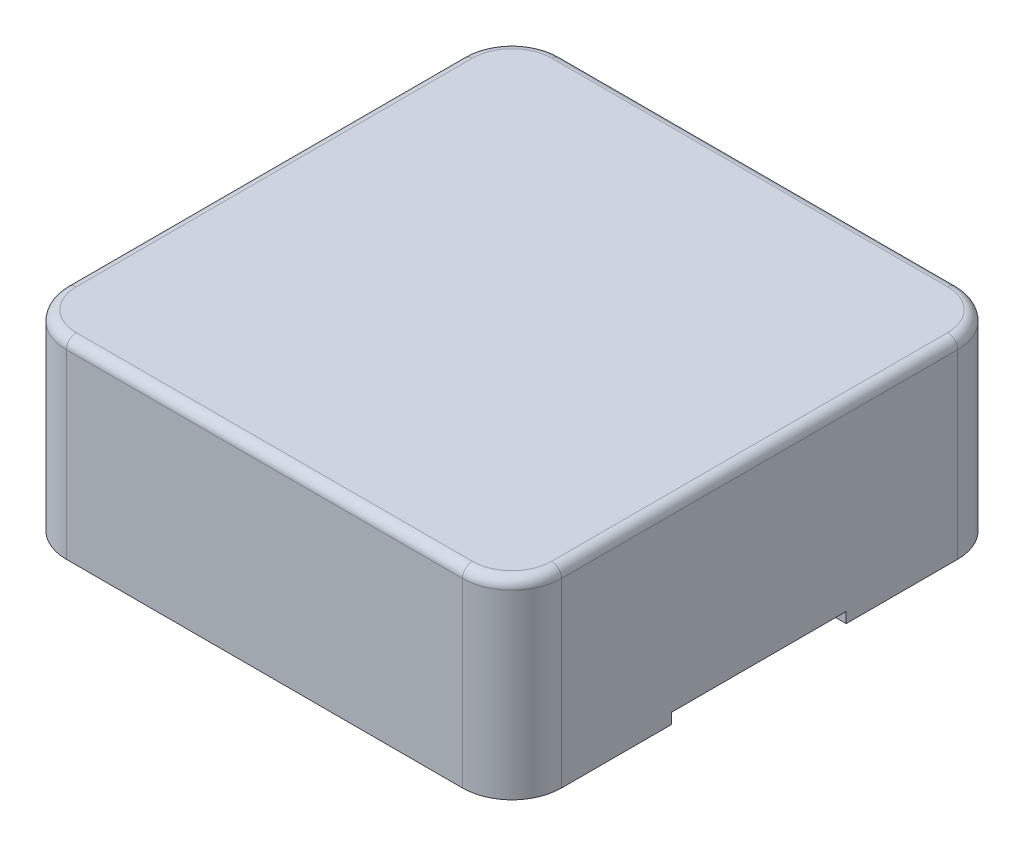
ISO-10303-21;
HEADER;
FILE_DESCRIPTION(('STEP AP214'),'2;1');
FILE_NAME('part.step','',(''),(''),'','','');
FILE_SCHEMA(('AUTOMOTIVE_DESIGN { 1 0 10303 214 1 1 1 1 }'));
ENDSEC;
DATA;
#1=APPLICATION_CONTEXT('core data for automotive mechanical design processes');
#2=APPLICATION_PROTOCOL_DEFINITION('international standard','automotive_design',2000,#1);
#3=PRODUCT_CONTEXT('',#1,'mechanical');
#4=PRODUCT('Part','Part','',(#3));
#5=PRODUCT_RELATED_PRODUCT_CATEGORY('part','',(#4));
#6=PRODUCT_DEFINITION_FORMATION('','',#4);
#7=PRODUCT_DEFINITION_CONTEXT('part definition',#1,'design');
#8=PRODUCT_DEFINITION('design','',#6,#7);
#9=PRODUCT_DEFINITION_SHAPE('','',#8);
#10=(LENGTH_UNIT() NAMED_UNIT(*) SI_UNIT(.MILLI.,.METRE.));
#11=(NAMED_UNIT(*) PLANE_ANGLE_UNIT() SI_UNIT($,.RADIAN.));
#12=(NAMED_UNIT(*) SI_UNIT($,.STERADIAN.) SOLID_ANGLE_UNIT());
#13=UNCERTAINTY_MEASURE_WITH_UNIT(LENGTH_MEASURE(1.E-05),#10,'distance_accuracy_value','');
#14=(GEOMETRIC_REPRESENTATION_CONTEXT(3) GLOBAL_UNCERTAINTY_ASSIGNED_CONTEXT((#13)) GLOBAL_UNIT_ASSIGNED_CONTEXT((#10,
#11,#12)) REPRESENTATION_CONTEXT('',''));
#15=CARTESIAN_POINT('',(0.,0.,0.));
#16=DIRECTION('',(0.,0.,1.));
#17=DIRECTION('',(1.,0.,0.));
#18=AXIS2_PLACEMENT_3D('',#15,#16,#17);
#19=CARTESIAN_POINT('',(2.108463048935,-1.899999976158,1.764024019241));
#20=DIRECTION('',(0.,0.,1.));
#21=DIRECTION('',(0.,-1.,0.));
#22=AXIS2_PLACEMENT_3D('',#19,#20,#21);
#23=PLANE('',#22);
#24=DIRECTION('',(0.,1.,0.));
#25=VECTOR('',#24,1.);
#26=CARTESIAN_POINT('',(2.108463048935,-1.899999976158,1.764024019241));
#27=LINE('',#26,#25);
#28=CARTESIAN_POINT('',(2.108463048935,-1.90000007152543,1.764024019241));
#29=VERTEX_POINT('',#28);
#30=CARTESIAN_POINT('',(2.108463048935,-1.685999976158,1.764024019241));
#31=VERTEX_POINT('',#30);
#32=EDGE_CURVE('E200',#29,#31,#27,.T.);
#33=ORIENTED_EDGE('',*,*,#32,.T.);
#34=DIRECTION('',(1.,0.,0.));
#35=VECTOR('',#34,1.);
#36=CARTESIAN_POINT('',(0.035624027251997,-1.685999976158,1.764024019241));
#37=LINE('',#36,#35);
#38=CARTESIAN_POINT('',(5.035624027252,-1.685999976158,1.764024019241));
#39=VERTEX_POINT('',#38);
#40=EDGE_CURVE('E248',#31,#39,#37,.T.);
#41=ORIENTED_EDGE('',*,*,#40,.T.);
#42=DIRECTION('',(0.,-1.,0.));
#43=VECTOR('',#42,1.);
#44=CARTESIAN_POINT('',(5.035624027252,-1.899999976158,1.764024019241));
#45=LINE('',#44,#43);
#46=CARTESIAN_POINT('',(5.03562402725199,-1.90000000794714,1.764024019241));
#47=VERTEX_POINT('',#46);
#48=EDGE_CURVE('E236',#47,#39,#45,.F.);
#49=ORIENTED_EDGE('',*,*,#48,.F.);
#50=DIRECTION('',(1.,0.,0.));
#51=VECTOR('',#50,1.);
#52=CARTESIAN_POINT('',(0.035624027251997,-1.90000007152543,1.764024019241));
#53=LINE('',#52,#51);
#54=EDGE_CURVE('E174',#29,#47,#53,.T.);
#55=ORIENTED_EDGE('',*,*,#54,.F.);
#56=EDGE_LOOP('',(#33,#41,#49,#55));
#57=FACE_BOUND('',#56,.T.);
#58=ADVANCED_FACE('F17',(#57),#23,.F.);
#59=CARTESIAN_POINT('',(-4.964375972748,-1.899999976158,1.764024019241));
#60=DIRECTION('',(0.,0.,1.));
#61=DIRECTION('',(0.,-1.,0.));
#62=AXIS2_PLACEMENT_3D('',#59,#60,#61);
#63=PLANE('',#62);
#64=DIRECTION('',(0.,-1.,0.));
#65=VECTOR('',#64,1.);
#66=CARTESIAN_POINT('',(-4.964375972748,-1.899999976158,1.764024019241));
#67=LINE('',#66,#65);
#68=CARTESIAN_POINT('',(-4.964375972748,-1.685999976158,1.764024019241));
#69=VERTEX_POINT('',#68);
#70=CARTESIAN_POINT('',(-4.964375972748,-1.90000000794714,1.764024019241));
#71=VERTEX_POINT('',#70);
#72=EDGE_CURVE('E232',#69,#71,#67,.T.);
#73=ORIENTED_EDGE('',*,*,#72,.F.);
#74=DIRECTION('',(1.,0.,0.));
#75=VECTOR('',#74,1.);
#76=CARTESIAN_POINT('',(0.035624027251997,-1.685999976158,1.764024019241));
#77=LINE('',#76,#75);
#78=CARTESIAN_POINT('',(-2.071772098541,-1.685999976158,1.764024019241));
#79=VERTEX_POINT('',#78);
#80=EDGE_CURVE('E269',#69,#79,#77,.T.);
#81=ORIENTED_EDGE('',*,*,#80,.T.);
#82=DIRECTION('',(0.,1.,0.));
#83=VECTOR('',#82,1.);
#84=CARTESIAN_POINT('',(-2.071772098541,-1.899999976158,1.764024019241));
#85=LINE('',#84,#83);
#86=CARTESIAN_POINT('',(-2.071772098541,-1.90000007152543,1.764024019241));
#87=VERTEX_POINT('',#86);
#88=EDGE_CURVE('E218',#79,#87,#85,.F.);
#89=ORIENTED_EDGE('',*,*,#88,.T.);
#90=DIRECTION('',(1.,0.,0.));
#91=VECTOR('',#90,1.);
#92=CARTESIAN_POINT('',(0.035624027251997,-1.90000007152543,1.764024019241));
#93=LINE('',#92,#91);
#94=EDGE_CURVE('E173',#71,#87,#93,.T.);
#95=ORIENTED_EDGE('',*,*,#94,.F.);
#96=EDGE_LOOP('',(#73,#81,#89,#95));
#97=FACE_BOUND('',#96,.T.);
#98=ADVANCED_FACE('F625',(#97),#63,.F.);
#99=CARTESIAN_POINT('',(-2.071772098541,-1.899999976158,1.764024019241));
#100=DIRECTION('',(1.,0.,0.));
#101=DIRECTION('',(0.,0.,-1.));
#102=AXIS2_PLACEMENT_3D('',#99,#100,#101);
#103=PLANE('',#102);
#104=ORIENTED_EDGE('',*,*,#88,.F.);
#105=DIRECTION('',(0.,0.,1.));
#106=VECTOR('',#105,1.);
#107=CARTESIAN_POINT('',(-2.071772098541,-1.685999976158,-0.0145459175110019));
#108=LINE('',#107,#106);
#109=CARTESIAN_POINT('',(-2.071772098541,-1.685999976158,-1.764024019241));
#110=VERTEX_POINT('',#109);
#111=EDGE_CURVE('E264',#79,#110,#108,.F.);
#112=ORIENTED_EDGE('',*,*,#111,.T.);
#113=DIRECTION('',(0.,1.,0.));
#114=VECTOR('',#113,1.);
#115=CARTESIAN_POINT('',(-2.071772098541,-1.899999976158,-1.764024019241));
#116=LINE('',#115,#114);
#117=CARTESIAN_POINT('',(-2.071772098541,-1.90000007152543,-1.764024019241));
#118=VERTEX_POINT('',#117);
#119=EDGE_CURVE('E201',#110,#118,#116,.F.);
#120=ORIENTED_EDGE('',*,*,#119,.T.);
#121=DIRECTION('',(0.,0.,-1.));
#122=VECTOR('',#121,1.);
#123=CARTESIAN_POINT('',(-2.071772098541,-1.90000007152543,-0.0145459175110019));
#124=LINE('',#123,#122);
#125=EDGE_CURVE('E225',#87,#118,#124,.T.);
#126=ORIENTED_EDGE('',*,*,#125,.F.);
#127=EDGE_LOOP('',(#104,#112,#120,#126));
#128=FACE_BOUND('',#127,.T.);
#129=ADVANCED_FACE('F622',(#128),#103,.F.);
#130=CARTESIAN_POINT('',(-2.071772098541,-1.899999976158,-1.764024019241));
#131=DIRECTION('',(0.,0.,-1.));
#132=DIRECTION('',(0.,1.,0.));
#133=AXIS2_PLACEMENT_3D('',#130,#131,#132);
#134=PLANE('',#133);
#135=ORIENTED_EDGE('',*,*,#119,.F.);
#136=DIRECTION('',(1.,0.,0.));
#137=VECTOR('',#136,1.);
#138=CARTESIAN_POINT('',(0.035624027251997,-1.685999976158,-1.764024019241));
#139=LINE('',#138,#137);
#140=CARTESIAN_POINT('',(-4.964375972748,-1.685999976158,-1.764024019241));
#141=VERTEX_POINT('',#140);
#142=EDGE_CURVE('E191',#110,#141,#139,.F.);
#143=ORIENTED_EDGE('',*,*,#142,.T.);
#144=DIRECTION('',(0.,1.,0.));
#145=VECTOR('',#144,1.);
#146=CARTESIAN_POINT('',(-4.964375972748,-1.899999976158,-1.764024019241));
#147=LINE('',#146,#145);
#148=CARTESIAN_POINT('',(-4.964375972748,-1.90000000794714,-1.764024019241));
#149=VERTEX_POINT('',#148);
#150=EDGE_CURVE('E216',#149,#141,#147,.T.);
#151=ORIENTED_EDGE('',*,*,#150,.F.);
#152=DIRECTION('',(1.,0.,0.));
#153=VECTOR('',#152,1.);
#154=CARTESIAN_POINT('',(0.035624027251997,-1.90000007152543,-1.764024019241));
#155=LINE('',#154,#153);
#156=EDGE_CURVE('E227',#118,#149,#155,.F.);
#157=ORIENTED_EDGE('',*,*,#156,.F.);
#158=EDGE_LOOP('',(#135,#143,#151,#157));
#159=FACE_BOUND('',#158,.T.);
#160=ADVANCED_FACE('F619',(#159),#134,.F.);
#161=CARTESIAN_POINT('',(5.035624027252,-1.899999976158,-1.764024019241));
#162=DIRECTION('',(0.,0.,-1.));
#163=DIRECTION('',(0.,1.,0.));
#164=AXIS2_PLACEMENT_3D('',#161,#162,#163);
#165=PLANE('',#164);
#166=DIRECTION('',(0.,1.,0.));
#167=VECTOR('',#166,1.);
#168=CARTESIAN_POINT('',(5.035624027252,-1.899999976158,-1.764024019241));
#169=LINE('',#168,#167);
#170=CARTESIAN_POINT('',(5.035624027252,-1.685999976158,-1.764024019241));
#171=VERTEX_POINT('',#170);
#172=CARTESIAN_POINT('',(5.03562402725199,-1.90000000794714,-1.764024019241));
#173=VERTEX_POINT('',#172);
#174=EDGE_CURVE('E198',#171,#173,#169,.F.);
#175=ORIENTED_EDGE('',*,*,#174,.F.);
#176=DIRECTION('',(1.,0.,0.));
#177=VECTOR('',#176,1.);
#178=CARTESIAN_POINT('',(0.035624027251997,-1.685999976158,-1.764024019241));
#179=LINE('',#178,#177);
#180=CARTESIAN_POINT('',(2.108463048935,-1.685999976158,-1.764024019241));
#181=VERTEX_POINT('',#180);
#182=EDGE_CURVE('E207',#171,#181,#179,.F.);
#183=ORIENTED_EDGE('',*,*,#182,.T.);
#184=DIRECTION('',(0.,1.,0.));
#185=VECTOR('',#184,1.);
#186=CARTESIAN_POINT('',(2.108463048935,-1.899999976158,-1.764024019241));
#187=LINE('',#186,#185);
#188=CARTESIAN_POINT('',(2.108463048935,-1.90000007152543,-1.764024019241));
#189=VERTEX_POINT('',#188);
#190=EDGE_CURVE('E204',#181,#189,#187,.F.);
#191=ORIENTED_EDGE('',*,*,#190,.T.);
#192=DIRECTION('',(1.,0.,0.));
#193=VECTOR('',#192,1.);
#194=CARTESIAN_POINT('',(0.035624027251997,-1.90000007152543,-1.764024019241));
#195=LINE('',#194,#193);
#196=EDGE_CURVE('E213',#173,#189,#195,.F.);
#197=ORIENTED_EDGE('',*,*,#196,.F.);
#198=EDGE_LOOP('',(#175,#183,#191,#197));
#199=FACE_BOUND('',#198,.T.);
#200=ADVANCED_FACE('F321',(#199),#165,.F.);
#201=CARTESIAN_POINT('',(2.108463048935,-1.899999976158,-1.764024019241));
#202=DIRECTION('',(-1.,0.,0.));
#203=DIRECTION('',(0.,0.,1.));
#204=AXIS2_PLACEMENT_3D('',#201,#202,#203);
#205=PLANE('',#204);
#206=ORIENTED_EDGE('',*,*,#190,.F.);
#207=DIRECTION('',(0.,0.,1.));
#208=VECTOR('',#207,1.);
#209=CARTESIAN_POINT('',(2.108463048935,-1.685999976158,-0.0145459175110019));
#210=LINE('',#209,#208);
#211=EDGE_CURVE('E245',#181,#31,#210,.T.);
#212=ORIENTED_EDGE('',*,*,#211,.T.);
#213=ORIENTED_EDGE('',*,*,#32,.F.);
#214=DIRECTION('',(0.,0.,-1.));
#215=VECTOR('',#214,1.);
#216=CARTESIAN_POINT('',(2.108463048935,-1.90000007152543,-0.0145459175110019));
#217=LINE('',#216,#215);
#218=EDGE_CURVE('E210',#189,#29,#217,.F.);
#219=ORIENTED_EDGE('',*,*,#218,.F.);
#220=EDGE_LOOP('',(#206,#212,#213,#219));
#221=FACE_BOUND('',#220,.T.);
#222=ADVANCED_FACE('F325',(#221),#205,.F.);
#223=CARTESIAN_POINT('',(0.035624027251997,-1.685999976158,-0.0145459175110019));
#224=DIRECTION('',(0.,1.,0.));
#225=DIRECTION('',(0.,0.,1.));
#226=AXIS2_PLACEMENT_3D('',#223,#224,#225);
#227=PLANE('',#226);
#228=ORIENTED_EDGE('',*,*,#211,.F.);
#229=ORIENTED_EDGE('',*,*,#182,.F.);
#230=DIRECTION('',(0.,0.,-1.));
#231=VECTOR('',#230,1.);
#232=CARTESIAN_POINT('',(5.03562402725199,-1.685999976158,3.985454082489));
#233=LINE('',#232,#231);
#234=EDGE_CURVE('E179',#39,#171,#233,.T.);
#235=ORIENTED_EDGE('',*,*,#234,.F.);
#236=ORIENTED_EDGE('',*,*,#40,.F.);
#237=EDGE_LOOP('',(#228,#229,#235,#236));
#238=FACE_BOUND('',#237,.T.);
#239=ADVANCED_FACE('F330',(#238),#227,.F.);
#240=CARTESIAN_POINT('',(4.035624027252,-1.899999976158,-4.014545917511));
#241=DIRECTION('',(0.,1.,0.));
#242=DIRECTION('',(0.,0.,1.));
#243=AXIS2_PLACEMENT_3D('',#240,#241,#242);
#244=CYLINDRICAL_SURFACE('',#243,1.);
#245=CARTESIAN_POINT('',(4.035624027252,-1.899999976158,-4.014545917511));
#246=DIRECTION('',(0.,1.,0.));
#247=DIRECTION('',(0.,0.,1.));
#248=AXIS2_PLACEMENT_3D('',#245,#246,#247);
#249=CIRCLE('',#248,1.);
#250=CARTESIAN_POINT('',(4.035624027252,-1.899999976158,-5.014545917511));
#251=VERTEX_POINT('',#250);
#252=CARTESIAN_POINT('',(5.03562402725199,-1.899999976158,-4.014545917511));
#253=VERTEX_POINT('',#252);
#254=EDGE_CURVE('E286',#251,#253,#249,.F.);
#255=ORIENTED_EDGE('',*,*,#254,.F.);
#256=DIRECTION('',(0.,1.,0.));
#257=VECTOR('',#256,1.);
#258=CARTESIAN_POINT('',(4.035624027252,-1.899999976158,-5.014545917511));
#259=LINE('',#258,#257);
#260=CARTESIAN_POINT('',(4.035624027252,1.766130018234,-5.014545917511));
#261=VERTEX_POINT('',#260);
#262=EDGE_CURVE('E197',#261,#251,#259,.F.);
#263=ORIENTED_EDGE('',*,*,#262,.F.);
#264=CARTESIAN_POINT('',(4.035624027252,1.766130018234,-4.014545917511));
#265=DIRECTION('',(0.,1.,0.));
#266=DIRECTION('',(0.,0.,1.));
#267=AXIS2_PLACEMENT_3D('',#264,#265,#266);
#268=CIRCLE('',#267,1.);
#269=CARTESIAN_POINT('',(5.03562402725199,1.766130018234,-4.014545917511));
#270=VERTEX_POINT('',#269);
#271=EDGE_CURVE('E257',#261,#270,#268,.F.);
#272=ORIENTED_EDGE('',*,*,#271,.T.);
#273=DIRECTION('',(0.,1.,0.));
#274=VECTOR('',#273,1.);
#275=CARTESIAN_POINT('',(5.03562402725199,-1.899999976158,-4.014545917511));
#276=LINE('',#275,#274);
#277=EDGE_CURVE('E315',#253,#270,#276,.T.);
#278=ORIENTED_EDGE('',*,*,#277,.F.);
#279=EDGE_LOOP('',(#255,#263,#272,#278));
#280=FACE_BOUND('',#279,.T.);
#281=ADVANCED_FACE('F334',(#280),#244,.T.);
#282=CARTESIAN_POINT('',(4.035624027252,-1.899999976158,3.985454082489));
#283=DIRECTION('',(0.,1.,0.));
#284=DIRECTION('',(0.,0.,1.));
#285=AXIS2_PLACEMENT_3D('',#282,#283,#284);
#286=CYLINDRICAL_SURFACE('',#285,0.999999999999998);
#287=CARTESIAN_POINT('',(4.035624027252,-1.899999976158,3.985454082489));
#288=DIRECTION('',(0.,1.,0.));
#289=DIRECTION('',(0.,0.,1.));
#290=AXIS2_PLACEMENT_3D('',#287,#288,#289);
#291=CIRCLE('',#290,0.999999999999998);
#292=CARTESIAN_POINT('',(5.03562402725199,-1.899999976158,3.985454082489));
#293=VERTEX_POINT('',#292);
#294=CARTESIAN_POINT('',(4.035624027252,-1.899999976158,4.985454082489));
#295=VERTEX_POINT('',#294);
#296=EDGE_CURVE('E20',#293,#295,#291,.F.);
#297=ORIENTED_EDGE('',*,*,#296,.F.);
#298=DIRECTION('',(0.,1.,0.));
#299=VECTOR('',#298,1.);
#300=CARTESIAN_POINT('',(5.03562402725199,-1.899999976158,3.985454082489));
#301=LINE('',#300,#299);
#302=CARTESIAN_POINT('',(5.03562402725199,1.766130018234,3.985454082489));
#303=VERTEX_POINT('',#302);
#304=EDGE_CURVE('E152',#303,#293,#301,.F.);
#305=ORIENTED_EDGE('',*,*,#304,.F.);
#306=CARTESIAN_POINT('',(4.035624027252,1.766130018234,3.985454082489));
#307=DIRECTION('',(0.,1.,0.));
#308=DIRECTION('',(0.,0.,1.));
#309=AXIS2_PLACEMENT_3D('',#306,#307,#308);
#310=CIRCLE('',#309,0.999999999999998);
#311=CARTESIAN_POINT('',(4.035624027252,1.766130018234,4.985454082489));
#312=VERTEX_POINT('',#311);
#313=EDGE_CURVE('E302',#303,#312,#310,.F.);
#314=ORIENTED_EDGE('',*,*,#313,.T.);
#315=DIRECTION('',(0.,-1.,0.));
#316=VECTOR('',#315,1.);
#317=CARTESIAN_POINT('',(4.035624027252,-1.899999976158,4.985454082489));
#318=LINE('',#317,#316);
#319=EDGE_CURVE('E169',#295,#312,#318,.F.);
#320=ORIENTED_EDGE('',*,*,#319,.F.);
#321=EDGE_LOOP('',(#297,#305,#314,#320));
#322=FACE_BOUND('',#321,.T.);
#323=ADVANCED_FACE('F167',(#322),#286,.T.);
#324=CARTESIAN_POINT('',(-3.964375972748,-1.899999976158,-4.014545917511));
#325=DIRECTION('',(0.,1.,0.));
#326=DIRECTION('',(0.,0.,1.));
#327=AXIS2_PLACEMENT_3D('',#324,#325,#326);
#328=CYLINDRICAL_SURFACE('',#327,1.);
#329=CARTESIAN_POINT('',(-3.964375972748,-1.899999976158,-4.014545917511));
#330=DIRECTION('',(0.,1.,0.));
#331=DIRECTION('',(0.,0.,1.));
#332=AXIS2_PLACEMENT_3D('',#329,#330,#331);
#333=CIRCLE('',#332,1.);
#334=CARTESIAN_POINT('',(-4.964375972748,-1.899999976158,-4.014545917511));
#335=VERTEX_POINT('',#334);
#336=CARTESIAN_POINT('',(-3.964375972748,-1.899999976158,-5.014545917511));
#337=VERTEX_POINT('',#336);
#338=EDGE_CURVE('E287',#335,#337,#333,.F.);
#339=ORIENTED_EDGE('',*,*,#338,.F.);
#340=DIRECTION('',(0.,1.,0.));
#341=VECTOR('',#340,1.);
#342=CARTESIAN_POINT('',(-4.964375972748,-1.899999976158,-4.014545917511));
#343=LINE('',#342,#341);
#344=CARTESIAN_POINT('',(-4.964375972748,1.766130018234,-4.014545917511));
#345=VERTEX_POINT('',#344);
#346=EDGE_CURVE('E367',#345,#335,#343,.F.);
#347=ORIENTED_EDGE('',*,*,#346,.F.);
#348=CARTESIAN_POINT('',(-3.964375972748,1.766130018234,-4.014545917511));
#349=DIRECTION('',(0.,1.,0.));
#350=DIRECTION('',(0.,0.,1.));
#351=AXIS2_PLACEMENT_3D('',#348,#349,#350);
#352=CIRCLE('',#351,1.);
#353=CARTESIAN_POINT('',(-3.964375972748,1.766130018234,-5.014545917511));
#354=VERTEX_POINT('',#353);
#355=EDGE_CURVE('E281',#345,#354,#352,.F.);
#356=ORIENTED_EDGE('',*,*,#355,.T.);
#357=DIRECTION('',(0.,1.,0.));
#358=VECTOR('',#357,1.);
#359=CARTESIAN_POINT('',(-3.964375972748,-1.899999976158,-5.014545917511));
#360=LINE('',#359,#358);
#361=EDGE_CURVE('E163',#337,#354,#360,.T.);
#362=ORIENTED_EDGE('',*,*,#361,.F.);
#363=EDGE_LOOP('',(#339,#347,#356,#362));
#364=FACE_BOUND('',#363,.T.);
#365=ADVANCED_FACE('F604',(#364),#328,.T.);
#366=CARTESIAN_POINT('',(0.035624027251997,-1.685999976158,-0.0145459175110019));
#367=DIRECTION('',(0.,1.,0.));
#368=DIRECTION('',(0.,0.,1.));
#369=AXIS2_PLACEMENT_3D('',#366,#367,#368);
#370=PLANE('',#369);
#371=ORIENTED_EDGE('',*,*,#111,.F.);
#372=ORIENTED_EDGE('',*,*,#80,.F.);
#373=DIRECTION('',(0.,0.,1.));
#374=VECTOR('',#373,1.);
#375=CARTESIAN_POINT('',(-4.964375972748,-1.685999976158,-4.014545917511));
#376=LINE('',#375,#374);
#377=EDGE_CURVE('E272',#141,#69,#376,.T.);
#378=ORIENTED_EDGE('',*,*,#377,.F.);
#379=ORIENTED_EDGE('',*,*,#142,.F.);
#380=EDGE_LOOP('',(#371,#372,#378,#379));
#381=FACE_BOUND('',#380,.T.);
#382=ADVANCED_FACE('F598',(#381),#370,.F.);
#383=CARTESIAN_POINT('',(0.035624027251997,-1.90000007152543,-0.0145459175110019));
#384=DIRECTION('',(0.,-1.,0.));
#385=DIRECTION('',(0.,0.,-1.));
#386=AXIS2_PLACEMENT_3D('',#383,#384,#385);
#387=PLANE('',#386);
#388=ORIENTED_EDGE('',*,*,#196,.T.);
#389=ORIENTED_EDGE('',*,*,#218,.T.);
#390=ORIENTED_EDGE('',*,*,#54,.T.);
#391=DIRECTION('',(0.,0.,-1.));
#392=VECTOR('',#391,1.);
#393=CARTESIAN_POINT('',(5.03562402725199,-1.899999976158,3.985454082489));
#394=LINE('',#393,#392);
#395=EDGE_CURVE('E157',#293,#47,#394,.T.);
#396=ORIENTED_EDGE('',*,*,#395,.F.);
#397=ORIENTED_EDGE('',*,*,#296,.T.);
#398=DIRECTION('',(1.,0.,0.));
#399=VECTOR('',#398,1.);
#400=CARTESIAN_POINT('',(-3.964375972748,-1.899999976158,4.985454082489));
#401=LINE('',#400,#399);
#402=CARTESIAN_POINT('',(-3.964375972748,-1.899999976158,4.985454082489));
#403=VERTEX_POINT('',#402);
#404=EDGE_CURVE('E308',#403,#295,#401,.T.);
#405=ORIENTED_EDGE('',*,*,#404,.F.);
#406=CARTESIAN_POINT('',(-3.964375972748,-1.899999976158,3.985454082489));
#407=DIRECTION('',(0.,1.,0.));
#408=DIRECTION('',(0.,0.,1.));
#409=AXIS2_PLACEMENT_3D('',#406,#407,#408);
#410=CIRCLE('',#409,0.999999999999999);
#411=CARTESIAN_POINT('',(-4.964375972748,-1.899999976158,3.985454082489));
#412=VERTEX_POINT('',#411);
#413=EDGE_CURVE('E284',#412,#403,#410,.T.);
#414=ORIENTED_EDGE('',*,*,#413,.F.);
#415=DIRECTION('',(0.,0.,1.));
#416=VECTOR('',#415,1.);
#417=CARTESIAN_POINT('',(-4.964375972748,-1.899999976158,-4.014545917511));
#418=LINE('',#417,#416);
#419=EDGE_CURVE('E275',#71,#412,#418,.T.);
#420=ORIENTED_EDGE('',*,*,#419,.F.);
#421=ORIENTED_EDGE('',*,*,#94,.T.);
#422=ORIENTED_EDGE('',*,*,#125,.T.);
#423=ORIENTED_EDGE('',*,*,#156,.T.);
#424=DIRECTION('',(0.,0.,1.));
#425=VECTOR('',#424,1.);
#426=CARTESIAN_POINT('',(-4.964375972748,-1.899999976158,-4.014545917511));
#427=LINE('',#426,#425);
#428=EDGE_CURVE('E276',#335,#149,#427,.T.);
#429=ORIENTED_EDGE('',*,*,#428,.F.);
#430=ORIENTED_EDGE('',*,*,#338,.T.);
#431=DIRECTION('',(1.,0.,0.));
#432=VECTOR('',#431,1.);
#433=CARTESIAN_POINT('',(4.035624027252,-1.899999976158,-5.014545917511));
#434=LINE('',#433,#432);
#435=EDGE_CURVE('E194',#251,#337,#434,.F.);
#436=ORIENTED_EDGE('',*,*,#435,.F.);
#437=ORIENTED_EDGE('',*,*,#254,.T.);
#438=DIRECTION('',(0.,0.,-1.));
#439=VECTOR('',#438,1.);
#440=CARTESIAN_POINT('',(5.03562402725199,-1.899999976158,3.985454082489));
#441=LINE('',#440,#439);
#442=EDGE_CURVE('E182',#173,#253,#441,.T.);
#443=ORIENTED_EDGE('',*,*,#442,.F.);
#444=EDGE_LOOP('',(#388,#389,#390,#396,#397,#405,#414,#420,#421,#422,#423,#429,#430,#436,#437,#443));
#445=FACE_BOUND('',#444,.T.);
#446=ADVANCED_FACE('F176',(#445),#387,.T.);
#447=CARTESIAN_POINT('',(-3.964375972748,-1.899999976158,3.985454082489));
#448=DIRECTION('',(0.,1.,0.));
#449=DIRECTION('',(0.,0.,1.));
#450=AXIS2_PLACEMENT_3D('',#447,#448,#449);
#451=CYLINDRICAL_SURFACE('',#450,0.999999999999999);
#452=ORIENTED_EDGE('',*,*,#413,.T.);
#453=DIRECTION('',(0.,-1.,0.));
#454=VECTOR('',#453,1.);
#455=CARTESIAN_POINT('',(-3.964375972748,-1.899999976158,4.985454082489));
#456=LINE('',#455,#454);
#457=CARTESIAN_POINT('',(-3.964375972748,1.766130018234,4.985454082489));
#458=VERTEX_POINT('',#457);
#459=EDGE_CURVE('E310',#458,#403,#456,.T.);
#460=ORIENTED_EDGE('',*,*,#459,.F.);
#461=CARTESIAN_POINT('',(-3.964375972748,1.766130018234,3.985454082489));
#462=DIRECTION('',(0.,1.,0.));
#463=DIRECTION('',(0.,0.,1.));
#464=AXIS2_PLACEMENT_3D('',#461,#462,#463);
#465=CIRCLE('',#464,0.999999999999999);
#466=CARTESIAN_POINT('',(-4.964375972748,1.766130018234,3.985454082489));
#467=VERTEX_POINT('',#466);
#468=EDGE_CURVE('E212',#458,#467,#465,.F.);
#469=ORIENTED_EDGE('',*,*,#468,.T.);
#470=DIRECTION('',(0.,1.,0.));
#471=VECTOR('',#470,1.);
#472=CARTESIAN_POINT('',(-4.964375972748,-1.899999976158,3.985454082489));
#473=LINE('',#472,#471);
#474=EDGE_CURVE('E362',#412,#467,#473,.T.);
#475=ORIENTED_EDGE('',*,*,#474,.F.);
#476=EDGE_LOOP('',(#452,#460,#469,#475));
#477=FACE_BOUND('',#476,.T.);
#478=ADVANCED_FACE('F588',(#477),#451,.T.);
#479=CARTESIAN_POINT('',(4.035624027252,-1.899999976158,-5.014545917511));
#480=DIRECTION('',(0.,0.,-1.));
#481=DIRECTION('',(0.,1.,0.));
#482=AXIS2_PLACEMENT_3D('',#479,#480,#481);
#483=PLANE('',#482);
#484=ORIENTED_EDGE('',*,*,#435,.T.);
#485=ORIENTED_EDGE('',*,*,#361,.T.);
#486=DIRECTION('',(-1.,0.,0.));
#487=VECTOR('',#486,1.);
#488=CARTESIAN_POINT('',(2.035624027252,1.766130018234,-5.014545917511));
#489=LINE('',#488,#487);
#490=EDGE_CURVE('E344',#261,#354,#489,.T.);
#491=ORIENTED_EDGE('',*,*,#490,.F.);
#492=ORIENTED_EDGE('',*,*,#262,.T.);
#493=EDGE_LOOP('',(#484,#485,#491,#492));
#494=FACE_BOUND('',#493,.T.);
#495=ADVANCED_FACE('F590',(#494),#483,.T.);
#496=CARTESIAN_POINT('',(5.03562402725199,-1.899999976158,3.985454082489));
#497=DIRECTION('',(1.,0.,0.));
#498=DIRECTION('',(0.,0.,-1.));
#499=AXIS2_PLACEMENT_3D('',#496,#497,#498);
#500=PLANE('',#499);
#501=ORIENTED_EDGE('',*,*,#442,.T.);
#502=ORIENTED_EDGE('',*,*,#277,.T.);
#503=DIRECTION('',(0.,0.,-1.));
#504=VECTOR('',#503,1.);
#505=CARTESIAN_POINT('',(5.03562402725199,1.766130018234,1.985454082489));
#506=LINE('',#505,#504);
#507=EDGE_CURVE('E160',#303,#270,#506,.T.);
#508=ORIENTED_EDGE('',*,*,#507,.F.);
#509=ORIENTED_EDGE('',*,*,#304,.T.);
#510=ORIENTED_EDGE('',*,*,#395,.T.);
#511=ORIENTED_EDGE('',*,*,#48,.T.);
#512=ORIENTED_EDGE('',*,*,#234,.T.);
#513=ORIENTED_EDGE('',*,*,#174,.T.);
#514=EDGE_LOOP('',(#501,#502,#508,#509,#510,#511,#512,#513));
#515=FACE_BOUND('',#514,.T.);
#516=ADVANCED_FACE('F155',(#515),#500,.T.);
#517=CARTESIAN_POINT('',(-3.964375972748,-1.899999976158,4.985454082489));
#518=DIRECTION('',(0.,0.,1.));
#519=DIRECTION('',(0.,-1.,0.));
#520=AXIS2_PLACEMENT_3D('',#517,#518,#519);
#521=PLANE('',#520);
#522=ORIENTED_EDGE('',*,*,#404,.T.);
#523=ORIENTED_EDGE('',*,*,#319,.T.);
#524=DIRECTION('',(1.,0.,0.));
#525=VECTOR('',#524,1.);
#526=CARTESIAN_POINT('',(-1.964375972748,1.766130018234,4.985454082489));
#527=LINE('',#526,#525);
#528=EDGE_CURVE('E379',#458,#312,#527,.T.);
#529=ORIENTED_EDGE('',*,*,#528,.F.);
#530=ORIENTED_EDGE('',*,*,#459,.T.);
#531=EDGE_LOOP('',(#522,#523,#529,#530));
#532=FACE_BOUND('',#531,.T.);
#533=ADVANCED_FACE('F586',(#532),#521,.T.);
#534=CARTESIAN_POINT('',(-4.964375972748,-1.899999976158,-4.014545917511));
#535=DIRECTION('',(-1.,0.,0.));
#536=DIRECTION('',(0.,0.,1.));
#537=AXIS2_PLACEMENT_3D('',#534,#535,#536);
#538=PLANE('',#537);
#539=ORIENTED_EDGE('',*,*,#419,.T.);
#540=ORIENTED_EDGE('',*,*,#474,.T.);
#541=DIRECTION('',(0.,0.,1.));
#542=VECTOR('',#541,1.);
#543=CARTESIAN_POINT('',(-4.964375972748,1.766130018234,-2.014545917511));
#544=LINE('',#543,#542);
#545=EDGE_CURVE('E448',#345,#467,#544,.T.);
#546=ORIENTED_EDGE('',*,*,#545,.F.);
#547=ORIENTED_EDGE('',*,*,#346,.T.);
#548=ORIENTED_EDGE('',*,*,#428,.T.);
#549=ORIENTED_EDGE('',*,*,#150,.T.);
#550=ORIENTED_EDGE('',*,*,#377,.T.);
#551=ORIENTED_EDGE('',*,*,#72,.T.);
#552=EDGE_LOOP('',(#539,#540,#546,#547,#548,#549,#550,#551));
#553=FACE_BOUND('',#552,.T.);
#554=ADVANCED_FACE('F442',(#553),#538,.T.);
#555=CARTESIAN_POINT('',(-3.964375972748,1.766130018234,-4.014545917511));
#556=DIRECTION('',(0.,1.,0.));
#557=DIRECTION('',(0.,0.,1.));
#558=AXIS2_PLACEMENT_3D('',#555,#556,#557);
#559=TOROIDAL_SURFACE('',#558,0.800000000000001,0.2);
#560=CARTESIAN_POINT('',(-3.964375972748,1.766130018234,-4.814545917511));
#561=DIRECTION('',(-1.,0.,0.));
#562=DIRECTION('',(0.,0.,1.));
#563=AXIS2_PLACEMENT_3D('',#560,#561,#562);
#564=CIRCLE('',#563,0.2);
#565=CARTESIAN_POINT('',(-3.964375972748,1.966130018234,-4.814545917511));
#566=VERTEX_POINT('',#565);
#567=EDGE_CURVE('E348',#354,#566,#564,.F.);
#568=ORIENTED_EDGE('',*,*,#567,.F.);
#569=ORIENTED_EDGE('',*,*,#355,.F.);
#570=CARTESIAN_POINT('',(-4.764375972748,1.766130018234,-4.014545917511));
#571=DIRECTION('',(0.,0.,1.));
#572=DIRECTION('',(1.,0.,0.));
#573=AXIS2_PLACEMENT_3D('',#570,#571,#572);
#574=CIRCLE('',#573,0.2);
#575=CARTESIAN_POINT('',(-4.764375972748,1.966130018234,-4.014545917511));
#576=VERTEX_POINT('',#575);
#577=EDGE_CURVE('E455',#576,#345,#574,.T.);
#578=ORIENTED_EDGE('',*,*,#577,.F.);
#579=CARTESIAN_POINT('',(-3.964375972748,1.966130018234,-4.014545917511));
#580=DIRECTION('',(0.,-1.,0.));
#581=DIRECTION('',(-1.,0.,0.));
#582=AXIS2_PLACEMENT_3D('',#579,#580,#581);
#583=CIRCLE('',#582,0.800000000000001);
#584=EDGE_CURVE('E471',#576,#566,#583,.T.);
#585=ORIENTED_EDGE('',*,*,#584,.T.);
#586=EDGE_LOOP('',(#568,#569,#578,#585));
#587=FACE_BOUND('',#586,.T.);
#588=ADVANCED_FACE('F438',(#587),#559,.T.);
#589=CARTESIAN_POINT('',(2.035624027252,1.766130018234,-4.814545917511));
#590=DIRECTION('',(-1.,0.,0.));
#591=DIRECTION('',(0.,0.,1.));
#592=AXIS2_PLACEMENT_3D('',#589,#590,#591);
#593=CYLINDRICAL_SURFACE('',#592,0.2);
#594=CARTESIAN_POINT('',(4.035624027252,1.766130018234,-4.814545917511));
#595=DIRECTION('',(-1.,0.,0.));
#596=DIRECTION('',(0.,0.,-1.));
#597=AXIS2_PLACEMENT_3D('',#594,#595,#596);
#598=CIRCLE('',#597,0.2);
#599=CARTESIAN_POINT('',(4.035624027252,1.966130018234,-4.814545917511));
#600=VERTEX_POINT('',#599);
#601=EDGE_CURVE('E347',#261,#600,#598,.F.);
#602=ORIENTED_EDGE('',*,*,#601,.F.);
#603=ORIENTED_EDGE('',*,*,#490,.T.);
#604=ORIENTED_EDGE('',*,*,#567,.T.);
#605=DIRECTION('',(1.,0.,0.));
#606=VECTOR('',#605,1.);
#607=CARTESIAN_POINT('',(0.035624027251997,1.966130018234,-4.814545917511));
#608=LINE('',#607,#606);
#609=EDGE_CURVE('E473',#566,#600,#608,.T.);
#610=ORIENTED_EDGE('',*,*,#609,.T.);
#611=EDGE_LOOP('',(#602,#603,#604,#610));
#612=FACE_BOUND('',#611,.T.);
#613=ADVANCED_FACE('F417',(#612),#593,.T.);
#614=CARTESIAN_POINT('',(4.035624027252,1.766130018234,-4.014545917511));
#615=DIRECTION('',(0.,1.,0.));
#616=DIRECTION('',(0.,0.,1.));
#617=AXIS2_PLACEMENT_3D('',#614,#615,#616);
#618=TOROIDAL_SURFACE('',#617,0.800000000000001,0.2);
#619=CARTESIAN_POINT('',(4.83562402725199,1.766130018234,-4.014545917511));
#620=DIRECTION('',(0.,0.,-1.));
#621=DIRECTION('',(-1.,0.,0.));
#622=AXIS2_PLACEMENT_3D('',#619,#620,#621);
#623=CIRCLE('',#622,0.2);
#624=CARTESIAN_POINT('',(4.83562402725199,1.966130018234,-4.014545917511));
#625=VERTEX_POINT('',#624);
#626=EDGE_CURVE('E392',#270,#625,#623,.F.);
#627=ORIENTED_EDGE('',*,*,#626,.F.);
#628=ORIENTED_EDGE('',*,*,#271,.F.);
#629=ORIENTED_EDGE('',*,*,#601,.T.);
#630=CARTESIAN_POINT('',(4.035624027252,1.966130018234,-4.014545917511));
#631=DIRECTION('',(0.,-1.,0.));
#632=DIRECTION('',(0.,0.,-1.));
#633=AXIS2_PLACEMENT_3D('',#630,#631,#632);
#634=CIRCLE('',#633,0.800000000000001);
#635=EDGE_CURVE('E577',#600,#625,#634,.T.);
#636=ORIENTED_EDGE('',*,*,#635,.T.);
#637=EDGE_LOOP('',(#627,#628,#629,#636));
#638=FACE_BOUND('',#637,.T.);
#639=ADVANCED_FACE('F411',(#638),#618,.T.);
#640=CARTESIAN_POINT('',(4.83562402725199,1.766130018234,1.985454082489));
#641=DIRECTION('',(0.,0.,-1.));
#642=DIRECTION('',(-1.,0.,0.));
#643=AXIS2_PLACEMENT_3D('',#640,#641,#642);
#644=CYLINDRICAL_SURFACE('',#643,0.2);
#645=CARTESIAN_POINT('',(4.835624027252,1.766130018234,3.985454082489));
#646=DIRECTION('',(0.,0.,-1.));
#647=DIRECTION('',(1.,0.,0.));
#648=AXIS2_PLACEMENT_3D('',#645,#646,#647);
#649=CIRCLE('',#648,0.2);
#650=CARTESIAN_POINT('',(4.835624027252,1.966130018234,3.985454082489));
#651=VERTEX_POINT('',#650);
#652=EDGE_CURVE('E391',#303,#651,#649,.F.);
#653=ORIENTED_EDGE('',*,*,#652,.F.);
#654=ORIENTED_EDGE('',*,*,#507,.T.);
#655=ORIENTED_EDGE('',*,*,#626,.T.);
#656=DIRECTION('',(0.,0.,-1.));
#657=VECTOR('',#656,1.);
#658=CARTESIAN_POINT('',(4.83562402725199,1.966130018234,-0.0145459175110019));
#659=LINE('',#658,#657);
#660=EDGE_CURVE('E575',#625,#651,#659,.F.);
#661=ORIENTED_EDGE('',*,*,#660,.T.);
#662=EDGE_LOOP('',(#653,#654,#655,#661));
#663=FACE_BOUND('',#662,.T.);
#664=ADVANCED_FACE('F416',(#663),#644,.T.);
#665=CARTESIAN_POINT('',(4.035624027252,1.766130018234,3.985454082489));
#666=DIRECTION('',(0.,1.,0.));
#667=DIRECTION('',(0.,0.,1.));
#668=AXIS2_PLACEMENT_3D('',#665,#666,#667);
#669=TOROIDAL_SURFACE('',#668,0.799999999999998,0.2);
#670=CARTESIAN_POINT('',(4.035624027252,1.766130018234,4.785454082489));
#671=DIRECTION('',(1.,0.,0.));
#672=DIRECTION('',(0.,0.,-1.));
#673=AXIS2_PLACEMENT_3D('',#670,#671,#672);
#674=CIRCLE('',#673,0.2);
#675=CARTESIAN_POINT('',(4.035624027252,1.966130018234,4.785454082489));
#676=VERTEX_POINT('',#675);
#677=EDGE_CURVE('E383',#312,#676,#674,.F.);
#678=ORIENTED_EDGE('',*,*,#677,.F.);
#679=ORIENTED_EDGE('',*,*,#313,.F.);
#680=ORIENTED_EDGE('',*,*,#652,.T.);
#681=CARTESIAN_POINT('',(4.035624027252,1.966130018234,3.985454082489));
#682=DIRECTION('',(0.,-1.,0.));
#683=DIRECTION('',(1.,0.,0.));
#684=AXIS2_PLACEMENT_3D('',#681,#682,#683);
#685=CIRCLE('',#684,0.799999999999999);
#686=EDGE_CURVE('E572',#651,#676,#685,.T.);
#687=ORIENTED_EDGE('',*,*,#686,.T.);
#688=EDGE_LOOP('',(#678,#679,#680,#687));
#689=FACE_BOUND('',#688,.T.);
#690=ADVANCED_FACE('F510',(#689),#669,.T.);
#691=CARTESIAN_POINT('',(-1.964375972748,1.766130018234,4.785454082489));
#692=DIRECTION('',(1.,0.,0.));
#693=DIRECTION('',(0.,0.,-1.));
#694=AXIS2_PLACEMENT_3D('',#691,#692,#693);
#695=CYLINDRICAL_SURFACE('',#694,0.2);
#696=CARTESIAN_POINT('',(-3.964375972748,1.766130018234,4.785454082489));
#697=DIRECTION('',(1.,0.,0.));
#698=DIRECTION('',(0.,0.,1.));
#699=AXIS2_PLACEMENT_3D('',#696,#697,#698);
#700=CIRCLE('',#699,0.2);
#701=CARTESIAN_POINT('',(-3.964375972748,1.966130018234,4.785454082489));
#702=VERTEX_POINT('',#701);
#703=EDGE_CURVE('E382',#458,#702,#700,.F.);
#704=ORIENTED_EDGE('',*,*,#703,.F.);
#705=ORIENTED_EDGE('',*,*,#528,.T.);
#706=ORIENTED_EDGE('',*,*,#677,.T.);
#707=DIRECTION('',(1.,0.,0.));
#708=VECTOR('',#707,1.);
#709=CARTESIAN_POINT('',(0.035624027251997,1.966130018234,4.785454082489));
#710=LINE('',#709,#708);
#711=EDGE_CURVE('E570',#676,#702,#710,.F.);
#712=ORIENTED_EDGE('',*,*,#711,.T.);
#713=EDGE_LOOP('',(#704,#705,#706,#712));
#714=FACE_BOUND('',#713,.T.);
#715=ADVANCED_FACE('F490',(#714),#695,.T.);
#716=CARTESIAN_POINT('',(-3.964375972748,1.766130018234,3.985454082489));
#717=DIRECTION('',(0.,1.,0.));
#718=DIRECTION('',(0.,0.,1.));
#719=AXIS2_PLACEMENT_3D('',#716,#717,#718);
#720=TOROIDAL_SURFACE('',#719,0.799999999999998,0.2);
#721=CARTESIAN_POINT('',(-4.764375972748,1.766130018234,3.985454082489));
#722=DIRECTION('',(0.,0.,1.));
#723=DIRECTION('',(1.,0.,0.));
#724=AXIS2_PLACEMENT_3D('',#721,#722,#723);
#725=CIRCLE('',#724,0.2);
#726=CARTESIAN_POINT('',(-4.764375972748,1.966130018234,3.985454082489));
#727=VERTEX_POINT('',#726);
#728=EDGE_CURVE('E34',#467,#727,#725,.F.);
#729=ORIENTED_EDGE('',*,*,#728,.F.);
#730=ORIENTED_EDGE('',*,*,#468,.F.);
#731=ORIENTED_EDGE('',*,*,#703,.T.);
#732=CARTESIAN_POINT('',(-3.964375972748,1.966130018234,3.985454082489));
#733=DIRECTION('',(0.,-1.,0.));
#734=DIRECTION('',(0.,0.,1.));
#735=AXIS2_PLACEMENT_3D('',#732,#733,#734);
#736=CIRCLE('',#735,0.799999999999999);
#737=EDGE_CURVE('E26',#702,#727,#736,.T.);
#738=ORIENTED_EDGE('',*,*,#737,.T.);
#739=EDGE_LOOP('',(#729,#730,#731,#738));
#740=FACE_BOUND('',#739,.T.);
#741=ADVANCED_FACE('F467',(#740),#720,.T.);
#742=CARTESIAN_POINT('',(-4.764375972748,1.766130018234,-2.014545917511));
#743=DIRECTION('',(0.,0.,1.));
#744=DIRECTION('',(1.,0.,0.));
#745=AXIS2_PLACEMENT_3D('',#742,#743,#744);
#746=CYLINDRICAL_SURFACE('',#745,0.2);
#747=ORIENTED_EDGE('',*,*,#728,.T.);
#748=DIRECTION('',(0.,0.,-1.));
#749=VECTOR('',#748,1.);
#750=CARTESIAN_POINT('',(-4.764375972748,1.966130018234,-0.0145459175110019));
#751=LINE('',#750,#749);
#752=EDGE_CURVE('E11',#727,#576,#751,.T.);
#753=ORIENTED_EDGE('',*,*,#752,.T.);
#754=ORIENTED_EDGE('',*,*,#577,.T.);
#755=ORIENTED_EDGE('',*,*,#545,.T.);
#756=EDGE_LOOP('',(#747,#753,#754,#755));
#757=FACE_BOUND('',#756,.T.);
#758=ADVANCED_FACE('F463',(#757),#746,.T.);
#759=CARTESIAN_POINT('',(0.035624027251997,1.966130018234,-0.0145459175110019));
#760=DIRECTION('',(0.,-1.,0.));
#761=DIRECTION('',(0.,0.,-1.));
#762=AXIS2_PLACEMENT_3D('',#759,#760,#761);
#763=PLANE('',#762);
#764=ORIENTED_EDGE('',*,*,#737,.F.);
#765=ORIENTED_EDGE('',*,*,#711,.F.);
#766=ORIENTED_EDGE('',*,*,#686,.F.);
#767=ORIENTED_EDGE('',*,*,#660,.F.);
#768=ORIENTED_EDGE('',*,*,#635,.F.);
#769=ORIENTED_EDGE('',*,*,#609,.F.);
#770=ORIENTED_EDGE('',*,*,#584,.F.);
#771=ORIENTED_EDGE('',*,*,#752,.F.);
#772=EDGE_LOOP('',(#764,#765,#766,#767,#768,#769,#770,#771));
#773=FACE_BOUND('',#772,.T.);
#774=ADVANCED_FACE('F528',(#773),#763,.F.);
#775=CLOSED_SHELL('',(#58,#98,#129,#160,#200,#222,#239,#281,#323,#365,#382,#446,#478,#495,#516,
#533,#554,#588,#613,#639,#664,#690,#715,#741,#758,#774));
#776=MANIFOLD_SOLID_BREP('B1',#775);
#777=ADVANCED_BREP_SHAPE_REPRESENTATION('',(#18,#776),#14);
#778=SHAPE_DEFINITION_REPRESENTATION(#9,#777);
ENDSEC;
END-ISO-10303-21;
